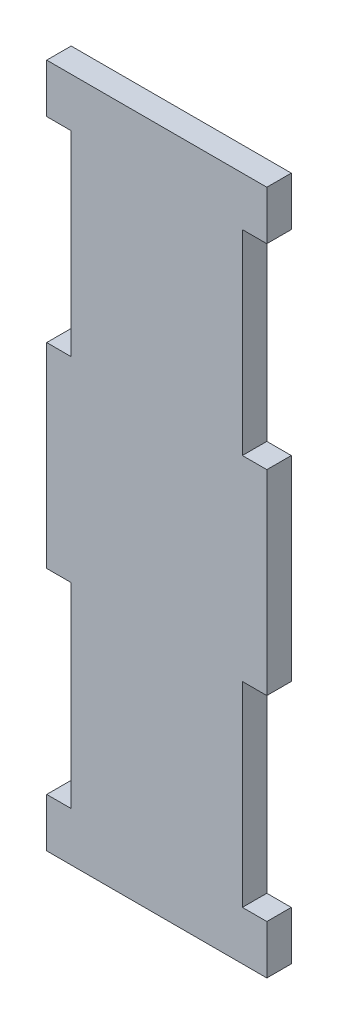
ISO-10303-21;
HEADER;
FILE_DESCRIPTION(('STEP AP214'),'2;1');
FILE_NAME('part.step','',(''),(''),'','','');
FILE_SCHEMA(('AUTOMOTIVE_DESIGN { 1 0 10303 214 1 1 1 1 }'));
ENDSEC;
DATA;
#1=APPLICATION_CONTEXT('core data for automotive mechanical design processes');
#2=APPLICATION_PROTOCOL_DEFINITION('international standard','automotive_design',2000,#1);
#3=PRODUCT_CONTEXT('',#1,'mechanical');
#4=PRODUCT('Part','Part','',(#3));
#5=PRODUCT_RELATED_PRODUCT_CATEGORY('part','',(#4));
#6=PRODUCT_DEFINITION_FORMATION('','',#4);
#7=PRODUCT_DEFINITION_CONTEXT('part definition',#1,'design');
#8=PRODUCT_DEFINITION('design','',#6,#7);
#9=PRODUCT_DEFINITION_SHAPE('','',#8);
#10=(LENGTH_UNIT() NAMED_UNIT(*) SI_UNIT(.MILLI.,.METRE.));
#11=(NAMED_UNIT(*) PLANE_ANGLE_UNIT() SI_UNIT($,.RADIAN.));
#12=(NAMED_UNIT(*) SI_UNIT($,.STERADIAN.) SOLID_ANGLE_UNIT());
#13=UNCERTAINTY_MEASURE_WITH_UNIT(LENGTH_MEASURE(1.E-05),#10,'distance_accuracy_value','');
#14=(GEOMETRIC_REPRESENTATION_CONTEXT(3) GLOBAL_UNCERTAINTY_ASSIGNED_CONTEXT((#13)) GLOBAL_UNIT_ASSIGNED_CONTEXT((#10,
#11,#12)) REPRESENTATION_CONTEXT('',''));
#15=CARTESIAN_POINT('',(0.,0.,0.));
#16=DIRECTION('',(0.,0.,1.));
#17=DIRECTION('',(1.,0.,0.));
#18=AXIS2_PLACEMENT_3D('',#15,#16,#17);
#19=CARTESIAN_POINT('',(0.,0.,10.));
#20=DIRECTION('',(1.,0.,0.));
#21=DIRECTION('',(0.,0.,-1.));
#22=AXIS2_PLACEMENT_3D('',#19,#20,#21);
#23=PLANE('',#22);
#24=DIRECTION('',(0.,-1.,0.));
#25=VECTOR('',#24,1.);
#26=CARTESIAN_POINT('',(0.,0.,0.));
#27=LINE('',#26,#25);
#28=CARTESIAN_POINT('',(0.,20.,0.));
#29=VERTEX_POINT('',#28);
#30=CARTESIAN_POINT('',(0.,0.,0.));
#31=VERTEX_POINT('',#30);
#32=EDGE_CURVE('E201',#29,#31,#27,.T.);
#33=ORIENTED_EDGE('',*,*,#32,.T.);
#34=DIRECTION('',(0.,0.,-1.));
#35=VECTOR('',#34,1.);
#36=CARTESIAN_POINT('',(0.,0.,10.));
#37=LINE('',#36,#35);
#38=CARTESIAN_POINT('',(0.,0.,10.));
#39=VERTEX_POINT('',#38);
#40=EDGE_CURVE('E11',#39,#31,#37,.T.);
#41=ORIENTED_EDGE('',*,*,#40,.F.);
#42=DIRECTION('',(0.,-1.,0.));
#43=VECTOR('',#42,1.);
#44=CARTESIAN_POINT('',(0.,0.,10.));
#45=LINE('',#44,#43);
#46=CARTESIAN_POINT('',(0.,20.,10.));
#47=VERTEX_POINT('',#46);
#48=EDGE_CURVE('E239',#47,#39,#45,.T.);
#49=ORIENTED_EDGE('',*,*,#48,.F.);
#50=DIRECTION('',(0.,0.,-1.));
#51=VECTOR('',#50,1.);
#52=CARTESIAN_POINT('',(0.,20.,10.));
#53=LINE('',#52,#51);
#54=EDGE_CURVE('E197',#47,#29,#53,.T.);
#55=ORIENTED_EDGE('',*,*,#54,.T.);
#56=EDGE_LOOP('',(#33,#41,#49,#55));
#57=FACE_BOUND('',#56,.T.);
#58=ADVANCED_FACE('F33',(#57),#23,.F.);
#59=CARTESIAN_POINT('',(0.,0.,10.));
#60=DIRECTION('',(0.,1.,0.));
#61=DIRECTION('',(-1.,0.,0.));
#62=AXIS2_PLACEMENT_3D('',#59,#60,#61);
#63=PLANE('',#62);
#64=DIRECTION('',(1.,0.,0.));
#65=VECTOR('',#64,1.);
#66=CARTESIAN_POINT('',(0.,0.,0.));
#67=LINE('',#66,#65);
#68=CARTESIAN_POINT('',(90.,0.,0.));
#69=VERTEX_POINT('',#68);
#70=EDGE_CURVE('E204',#31,#69,#67,.T.);
#71=ORIENTED_EDGE('',*,*,#70,.T.);
#72=DIRECTION('',(0.,0.,-1.));
#73=VECTOR('',#72,1.);
#74=CARTESIAN_POINT('',(90.,0.,10.));
#75=LINE('',#74,#73);
#76=CARTESIAN_POINT('',(90.,0.,10.));
#77=VERTEX_POINT('',#76);
#78=EDGE_CURVE('E41',#77,#69,#75,.T.);
#79=ORIENTED_EDGE('',*,*,#78,.F.);
#80=DIRECTION('',(1.,0.,0.));
#81=VECTOR('',#80,1.);
#82=CARTESIAN_POINT('',(0.,0.,10.));
#83=LINE('',#82,#81);
#84=EDGE_CURVE('E128',#39,#77,#83,.T.);
#85=ORIENTED_EDGE('',*,*,#84,.F.);
#86=ORIENTED_EDGE('',*,*,#40,.T.);
#87=EDGE_LOOP('',(#71,#79,#85,#86));
#88=FACE_BOUND('',#87,.T.);
#89=ADVANCED_FACE('F357',(#88),#63,.F.);
#90=CARTESIAN_POINT('',(90.,0.,10.));
#91=DIRECTION('',(-1.,0.,0.));
#92=DIRECTION('',(0.,0.,1.));
#93=AXIS2_PLACEMENT_3D('',#90,#91,#92);
#94=PLANE('',#93);
#95=DIRECTION('',(0.,1.,0.));
#96=VECTOR('',#95,1.);
#97=CARTESIAN_POINT('',(90.,0.,0.));
#98=LINE('',#97,#96);
#99=CARTESIAN_POINT('',(90.,20.,0.));
#100=VERTEX_POINT('',#99);
#101=EDGE_CURVE('E206',#69,#100,#98,.T.);
#102=ORIENTED_EDGE('',*,*,#101,.T.);
#103=DIRECTION('',(0.,0.,-1.));
#104=VECTOR('',#103,1.);
#105=CARTESIAN_POINT('',(90.,20.,10.));
#106=LINE('',#105,#104);
#107=CARTESIAN_POINT('',(90.,20.,10.));
#108=VERTEX_POINT('',#107);
#109=EDGE_CURVE('E282',#108,#100,#106,.T.);
#110=ORIENTED_EDGE('',*,*,#109,.F.);
#111=DIRECTION('',(0.,1.,0.));
#112=VECTOR('',#111,1.);
#113=CARTESIAN_POINT('',(90.,0.,10.));
#114=LINE('',#113,#112);
#115=EDGE_CURVE('E290',#77,#108,#114,.T.);
#116=ORIENTED_EDGE('',*,*,#115,.F.);
#117=ORIENTED_EDGE('',*,*,#78,.T.);
#118=EDGE_LOOP('',(#102,#110,#116,#117));
#119=FACE_BOUND('',#118,.T.);
#120=ADVANCED_FACE('F288',(#119),#94,.F.);
#121=CARTESIAN_POINT('',(90.,20.,10.));
#122=DIRECTION('',(0.,-1.,0.));
#123=DIRECTION('',(1.,0.,0.));
#124=AXIS2_PLACEMENT_3D('',#121,#122,#123);
#125=PLANE('',#124);
#126=DIRECTION('',(-1.,0.,0.));
#127=VECTOR('',#126,1.);
#128=CARTESIAN_POINT('',(90.,20.,0.));
#129=LINE('',#128,#127);
#130=CARTESIAN_POINT('',(80.,20.,0.));
#131=VERTEX_POINT('',#130);
#132=EDGE_CURVE('E208',#100,#131,#129,.T.);
#133=ORIENTED_EDGE('',*,*,#132,.T.);
#134=DIRECTION('',(0.,0.,-1.));
#135=VECTOR('',#134,1.);
#136=CARTESIAN_POINT('',(80.,20.,10.));
#137=LINE('',#136,#135);
#138=CARTESIAN_POINT('',(80.,20.,10.));
#139=VERTEX_POINT('',#138);
#140=EDGE_CURVE('E279',#139,#131,#137,.T.);
#141=ORIENTED_EDGE('',*,*,#140,.F.);
#142=DIRECTION('',(-1.,0.,0.));
#143=VECTOR('',#142,1.);
#144=CARTESIAN_POINT('',(90.,20.,10.));
#145=LINE('',#144,#143);
#146=EDGE_CURVE('E308',#108,#139,#145,.T.);
#147=ORIENTED_EDGE('',*,*,#146,.F.);
#148=ORIENTED_EDGE('',*,*,#109,.T.);
#149=EDGE_LOOP('',(#133,#141,#147,#148));
#150=FACE_BOUND('',#149,.T.);
#151=ADVANCED_FACE('F299',(#150),#125,.F.);
#152=CARTESIAN_POINT('',(80.,20.,10.));
#153=DIRECTION('',(-1.,0.,0.));
#154=DIRECTION('',(0.,-1.,0.));
#155=AXIS2_PLACEMENT_3D('',#152,#153,#154);
#156=PLANE('',#155);
#157=DIRECTION('',(0.,1.,0.));
#158=VECTOR('',#157,1.);
#159=CARTESIAN_POINT('',(80.,20.,0.));
#160=LINE('',#159,#158);
#161=CARTESIAN_POINT('',(79.9999999999999,100.,0.));
#162=VERTEX_POINT('',#161);
#163=EDGE_CURVE('E210',#131,#162,#160,.T.);
#164=ORIENTED_EDGE('',*,*,#163,.T.);
#165=DIRECTION('',(0.,0.,-1.));
#166=VECTOR('',#165,1.);
#167=CARTESIAN_POINT('',(79.9999999999999,100.,10.));
#168=LINE('',#167,#166);
#169=CARTESIAN_POINT('',(79.9999999999999,100.,10.));
#170=VERTEX_POINT('',#169);
#171=EDGE_CURVE('E276',#170,#162,#168,.T.);
#172=ORIENTED_EDGE('',*,*,#171,.F.);
#173=DIRECTION('',(0.,1.,0.));
#174=VECTOR('',#173,1.);
#175=CARTESIAN_POINT('',(80.,20.,10.));
#176=LINE('',#175,#174);
#177=EDGE_CURVE('E305',#139,#170,#176,.T.);
#178=ORIENTED_EDGE('',*,*,#177,.F.);
#179=ORIENTED_EDGE('',*,*,#140,.T.);
#180=EDGE_LOOP('',(#164,#172,#178,#179));
#181=FACE_BOUND('',#180,.T.);
#182=ADVANCED_FACE('F303',(#181),#156,.F.);
#183=CARTESIAN_POINT('',(79.9999999999999,100.,10.));
#184=DIRECTION('',(0.,1.,0.));
#185=DIRECTION('',(0.,0.,1.));
#186=AXIS2_PLACEMENT_3D('',#183,#184,#185);
#187=PLANE('',#186);
#188=DIRECTION('',(1.,0.,0.));
#189=VECTOR('',#188,1.);
#190=CARTESIAN_POINT('',(79.9999999999999,100.,0.));
#191=LINE('',#190,#189);
#192=CARTESIAN_POINT('',(90.,100.,0.));
#193=VERTEX_POINT('',#192);
#194=EDGE_CURVE('E212',#162,#193,#191,.T.);
#195=ORIENTED_EDGE('',*,*,#194,.T.);
#196=DIRECTION('',(0.,0.,-1.));
#197=VECTOR('',#196,1.);
#198=CARTESIAN_POINT('',(90.,100.,10.));
#199=LINE('',#198,#197);
#200=CARTESIAN_POINT('',(90.,100.,10.));
#201=VERTEX_POINT('',#200);
#202=EDGE_CURVE('E273',#201,#193,#199,.T.);
#203=ORIENTED_EDGE('',*,*,#202,.F.);
#204=DIRECTION('',(1.,0.,0.));
#205=VECTOR('',#204,1.);
#206=CARTESIAN_POINT('',(79.9999999999999,100.,10.));
#207=LINE('',#206,#205);
#208=EDGE_CURVE('E307',#170,#201,#207,.T.);
#209=ORIENTED_EDGE('',*,*,#208,.F.);
#210=ORIENTED_EDGE('',*,*,#171,.T.);
#211=EDGE_LOOP('',(#195,#203,#209,#210));
#212=FACE_BOUND('',#211,.T.);
#213=ADVANCED_FACE('F370',(#212),#187,.F.);
#214=CARTESIAN_POINT('',(90.,100.,10.));
#215=DIRECTION('',(-1.,0.,0.));
#216=DIRECTION('',(0.,-1.,0.));
#217=AXIS2_PLACEMENT_3D('',#214,#215,#216);
#218=PLANE('',#217);
#219=DIRECTION('',(0.,1.,0.));
#220=VECTOR('',#219,1.);
#221=CARTESIAN_POINT('',(90.,100.,0.));
#222=LINE('',#221,#220);
#223=CARTESIAN_POINT('',(90.,180.,0.));
#224=VERTEX_POINT('',#223);
#225=EDGE_CURVE('E214',#193,#224,#222,.T.);
#226=ORIENTED_EDGE('',*,*,#225,.T.);
#227=DIRECTION('',(0.,0.,-1.));
#228=VECTOR('',#227,1.);
#229=CARTESIAN_POINT('',(90.,180.,10.));
#230=LINE('',#229,#228);
#231=CARTESIAN_POINT('',(90.,180.,10.));
#232=VERTEX_POINT('',#231);
#233=EDGE_CURVE('E270',#232,#224,#230,.T.);
#234=ORIENTED_EDGE('',*,*,#233,.F.);
#235=DIRECTION('',(0.,1.,0.));
#236=VECTOR('',#235,1.);
#237=CARTESIAN_POINT('',(90.,100.,10.));
#238=LINE('',#237,#236);
#239=EDGE_CURVE('E310',#201,#232,#238,.T.);
#240=ORIENTED_EDGE('',*,*,#239,.F.);
#241=ORIENTED_EDGE('',*,*,#202,.T.);
#242=EDGE_LOOP('',(#226,#234,#240,#241));
#243=FACE_BOUND('',#242,.T.);
#244=ADVANCED_FACE('F373',(#243),#218,.F.);
#245=CARTESIAN_POINT('',(90.,180.,10.));
#246=DIRECTION('',(0.,-1.,0.));
#247=DIRECTION('',(0.,0.,-1.));
#248=AXIS2_PLACEMENT_3D('',#245,#246,#247);
#249=PLANE('',#248);
#250=DIRECTION('',(-1.,0.,0.));
#251=VECTOR('',#250,1.);
#252=CARTESIAN_POINT('',(90.,180.,0.));
#253=LINE('',#252,#251);
#254=CARTESIAN_POINT('',(79.9999999999999,180.,0.));
#255=VERTEX_POINT('',#254);
#256=EDGE_CURVE('E216',#224,#255,#253,.T.);
#257=ORIENTED_EDGE('',*,*,#256,.T.);
#258=DIRECTION('',(0.,0.,-1.));
#259=VECTOR('',#258,1.);
#260=CARTESIAN_POINT('',(79.9999999999999,180.,10.));
#261=LINE('',#260,#259);
#262=CARTESIAN_POINT('',(79.9999999999999,180.,10.));
#263=VERTEX_POINT('',#262);
#264=EDGE_CURVE('E267',#263,#255,#261,.T.);
#265=ORIENTED_EDGE('',*,*,#264,.F.);
#266=DIRECTION('',(-1.,0.,0.));
#267=VECTOR('',#266,1.);
#268=CARTESIAN_POINT('',(90.,180.,10.));
#269=LINE('',#268,#267);
#270=EDGE_CURVE('E316',#232,#263,#269,.T.);
#271=ORIENTED_EDGE('',*,*,#270,.F.);
#272=ORIENTED_EDGE('',*,*,#233,.T.);
#273=EDGE_LOOP('',(#257,#265,#271,#272));
#274=FACE_BOUND('',#273,.T.);
#275=ADVANCED_FACE('F377',(#274),#249,.F.);
#276=CARTESIAN_POINT('',(79.9999999999999,180.,10.));
#277=DIRECTION('',(-1.,0.,0.));
#278=DIRECTION('',(0.,-1.,0.));
#279=AXIS2_PLACEMENT_3D('',#276,#277,#278);
#280=PLANE('',#279);
#281=DIRECTION('',(0.,1.,0.));
#282=VECTOR('',#281,1.);
#283=CARTESIAN_POINT('',(79.9999999999999,180.,0.));
#284=LINE('',#283,#282);
#285=CARTESIAN_POINT('',(79.9999999999999,260.,0.));
#286=VERTEX_POINT('',#285);
#287=EDGE_CURVE('E218',#255,#286,#284,.T.);
#288=ORIENTED_EDGE('',*,*,#287,.T.);
#289=DIRECTION('',(0.,0.,-1.));
#290=VECTOR('',#289,1.);
#291=CARTESIAN_POINT('',(79.9999999999999,260.,10.));
#292=LINE('',#291,#290);
#293=CARTESIAN_POINT('',(79.9999999999999,260.,10.));
#294=VERTEX_POINT('',#293);
#295=EDGE_CURVE('E264',#294,#286,#292,.T.);
#296=ORIENTED_EDGE('',*,*,#295,.F.);
#297=DIRECTION('',(0.,1.,0.));
#298=VECTOR('',#297,1.);
#299=CARTESIAN_POINT('',(79.9999999999999,180.,10.));
#300=LINE('',#299,#298);
#301=EDGE_CURVE('E318',#263,#294,#300,.T.);
#302=ORIENTED_EDGE('',*,*,#301,.F.);
#303=ORIENTED_EDGE('',*,*,#264,.T.);
#304=EDGE_LOOP('',(#288,#296,#302,#303));
#305=FACE_BOUND('',#304,.T.);
#306=ADVANCED_FACE('F381',(#305),#280,.F.);
#307=CARTESIAN_POINT('',(79.9999999999999,260.,10.));
#308=DIRECTION('',(0.,1.,0.));
#309=DIRECTION('',(0.,0.,1.));
#310=AXIS2_PLACEMENT_3D('',#307,#308,#309);
#311=PLANE('',#310);
#312=DIRECTION('',(1.,0.,0.));
#313=VECTOR('',#312,1.);
#314=CARTESIAN_POINT('',(79.9999999999999,260.,0.));
#315=LINE('',#314,#313);
#316=CARTESIAN_POINT('',(89.9999999999999,260.,0.));
#317=VERTEX_POINT('',#316);
#318=EDGE_CURVE('E220',#286,#317,#315,.T.);
#319=ORIENTED_EDGE('',*,*,#318,.T.);
#320=DIRECTION('',(0.,0.,-1.));
#321=VECTOR('',#320,1.);
#322=CARTESIAN_POINT('',(89.9999999999999,260.,10.));
#323=LINE('',#322,#321);
#324=CARTESIAN_POINT('',(89.9999999999999,260.,10.));
#325=VERTEX_POINT('',#324);
#326=EDGE_CURVE('E261',#325,#317,#323,.T.);
#327=ORIENTED_EDGE('',*,*,#326,.F.);
#328=DIRECTION('',(1.,0.,0.));
#329=VECTOR('',#328,1.);
#330=CARTESIAN_POINT('',(79.9999999999999,260.,10.));
#331=LINE('',#330,#329);
#332=EDGE_CURVE('E320',#294,#325,#331,.T.);
#333=ORIENTED_EDGE('',*,*,#332,.F.);
#334=ORIENTED_EDGE('',*,*,#295,.T.);
#335=EDGE_LOOP('',(#319,#327,#333,#334));
#336=FACE_BOUND('',#335,.T.);
#337=ADVANCED_FACE('F385',(#336),#311,.F.);
#338=CARTESIAN_POINT('',(89.9999999999999,260.,10.));
#339=DIRECTION('',(-1.,0.,0.));
#340=DIRECTION('',(0.,0.,1.));
#341=AXIS2_PLACEMENT_3D('',#338,#339,#340);
#342=PLANE('',#341);
#343=DIRECTION('',(0.,1.,0.));
#344=VECTOR('',#343,1.);
#345=CARTESIAN_POINT('',(89.9999999999999,260.,0.));
#346=LINE('',#345,#344);
#347=CARTESIAN_POINT('',(89.9999999999999,280.,0.));
#348=VERTEX_POINT('',#347);
#349=EDGE_CURVE('E222',#317,#348,#346,.T.);
#350=ORIENTED_EDGE('',*,*,#349,.T.);
#351=DIRECTION('',(0.,0.,-1.));
#352=VECTOR('',#351,1.);
#353=CARTESIAN_POINT('',(89.9999999999999,280.,10.));
#354=LINE('',#353,#352);
#355=CARTESIAN_POINT('',(89.9999999999999,280.,10.));
#356=VERTEX_POINT('',#355);
#357=EDGE_CURVE('E258',#356,#348,#354,.T.);
#358=ORIENTED_EDGE('',*,*,#357,.F.);
#359=DIRECTION('',(0.,1.,0.));
#360=VECTOR('',#359,1.);
#361=CARTESIAN_POINT('',(89.9999999999999,260.,10.));
#362=LINE('',#361,#360);
#363=EDGE_CURVE('E322',#325,#356,#362,.T.);
#364=ORIENTED_EDGE('',*,*,#363,.F.);
#365=ORIENTED_EDGE('',*,*,#326,.T.);
#366=EDGE_LOOP('',(#350,#358,#364,#365));
#367=FACE_BOUND('',#366,.T.);
#368=ADVANCED_FACE('F389',(#367),#342,.F.);
#369=CARTESIAN_POINT('',(0.,280.,10.));
#370=DIRECTION('',(0.,-1.,0.));
#371=DIRECTION('',(0.,0.,-1.));
#372=AXIS2_PLACEMENT_3D('',#369,#370,#371);
#373=PLANE('',#372);
#374=DIRECTION('',(-1.,0.,0.));
#375=VECTOR('',#374,1.);
#376=CARTESIAN_POINT('',(0.,280.,0.));
#377=LINE('',#376,#375);
#378=CARTESIAN_POINT('',(0.,280.,0.));
#379=VERTEX_POINT('',#378);
#380=EDGE_CURVE('E224',#348,#379,#377,.T.);
#381=ORIENTED_EDGE('',*,*,#380,.T.);
#382=DIRECTION('',(0.,0.,-1.));
#383=VECTOR('',#382,1.);
#384=CARTESIAN_POINT('',(0.,280.,10.));
#385=LINE('',#384,#383);
#386=CARTESIAN_POINT('',(0.,280.,10.));
#387=VERTEX_POINT('',#386);
#388=EDGE_CURVE('E255',#387,#379,#385,.T.);
#389=ORIENTED_EDGE('',*,*,#388,.F.);
#390=DIRECTION('',(-1.,0.,0.));
#391=VECTOR('',#390,1.);
#392=CARTESIAN_POINT('',(0.,280.,10.));
#393=LINE('',#392,#391);
#394=EDGE_CURVE('E324',#356,#387,#393,.T.);
#395=ORIENTED_EDGE('',*,*,#394,.F.);
#396=ORIENTED_EDGE('',*,*,#357,.T.);
#397=EDGE_LOOP('',(#381,#389,#395,#396));
#398=FACE_BOUND('',#397,.T.);
#399=ADVANCED_FACE('F393',(#398),#373,.F.);
#400=CARTESIAN_POINT('',(0.,260.,10.));
#401=DIRECTION('',(1.,0.,0.));
#402=DIRECTION('',(0.,0.,-1.));
#403=AXIS2_PLACEMENT_3D('',#400,#401,#402);
#404=PLANE('',#403);
#405=DIRECTION('',(0.,-1.,0.));
#406=VECTOR('',#405,1.);
#407=CARTESIAN_POINT('',(0.,260.,0.));
#408=LINE('',#407,#406);
#409=CARTESIAN_POINT('',(0.,260.,0.));
#410=VERTEX_POINT('',#409);
#411=EDGE_CURVE('E226',#379,#410,#408,.T.);
#412=ORIENTED_EDGE('',*,*,#411,.T.);
#413=DIRECTION('',(0.,0.,-1.));
#414=VECTOR('',#413,1.);
#415=CARTESIAN_POINT('',(0.,260.,10.));
#416=LINE('',#415,#414);
#417=CARTESIAN_POINT('',(0.,260.,10.));
#418=VERTEX_POINT('',#417);
#419=EDGE_CURVE('E252',#418,#410,#416,.T.);
#420=ORIENTED_EDGE('',*,*,#419,.F.);
#421=DIRECTION('',(0.,-1.,0.));
#422=VECTOR('',#421,1.);
#423=CARTESIAN_POINT('',(0.,260.,10.));
#424=LINE('',#423,#422);
#425=EDGE_CURVE('E326',#387,#418,#424,.T.);
#426=ORIENTED_EDGE('',*,*,#425,.F.);
#427=ORIENTED_EDGE('',*,*,#388,.T.);
#428=EDGE_LOOP('',(#412,#420,#426,#427));
#429=FACE_BOUND('',#428,.T.);
#430=ADVANCED_FACE('F397',(#429),#404,.F.);
#431=CARTESIAN_POINT('',(10.,260.,10.));
#432=DIRECTION('',(0.,1.,0.));
#433=DIRECTION('',(0.,0.,1.));
#434=AXIS2_PLACEMENT_3D('',#431,#432,#433);
#435=PLANE('',#434);
#436=DIRECTION('',(1.,0.,0.));
#437=VECTOR('',#436,1.);
#438=CARTESIAN_POINT('',(10.,260.,0.));
#439=LINE('',#438,#437);
#440=CARTESIAN_POINT('',(10.,260.,0.));
#441=VERTEX_POINT('',#440);
#442=EDGE_CURVE('E228',#410,#441,#439,.T.);
#443=ORIENTED_EDGE('',*,*,#442,.T.);
#444=DIRECTION('',(0.,0.,-1.));
#445=VECTOR('',#444,1.);
#446=CARTESIAN_POINT('',(10.,260.,10.));
#447=LINE('',#446,#445);
#448=CARTESIAN_POINT('',(10.,260.,10.));
#449=VERTEX_POINT('',#448);
#450=EDGE_CURVE('E249',#449,#441,#447,.T.);
#451=ORIENTED_EDGE('',*,*,#450,.F.);
#452=DIRECTION('',(1.,0.,0.));
#453=VECTOR('',#452,1.);
#454=CARTESIAN_POINT('',(10.,260.,10.));
#455=LINE('',#454,#453);
#456=EDGE_CURVE('E328',#418,#449,#455,.T.);
#457=ORIENTED_EDGE('',*,*,#456,.F.);
#458=ORIENTED_EDGE('',*,*,#419,.T.);
#459=EDGE_LOOP('',(#443,#451,#457,#458));
#460=FACE_BOUND('',#459,.T.);
#461=ADVANCED_FACE('F401',(#460),#435,.F.);
#462=CARTESIAN_POINT('',(10.,180.,10.));
#463=DIRECTION('',(1.,0.,0.));
#464=DIRECTION('',(0.,0.,-1.));
#465=AXIS2_PLACEMENT_3D('',#462,#463,#464);
#466=PLANE('',#465);
#467=DIRECTION('',(0.,-1.,0.));
#468=VECTOR('',#467,1.);
#469=CARTESIAN_POINT('',(10.,180.,0.));
#470=LINE('',#469,#468);
#471=CARTESIAN_POINT('',(10.,180.,0.));
#472=VERTEX_POINT('',#471);
#473=EDGE_CURVE('E230',#441,#472,#470,.T.);
#474=ORIENTED_EDGE('',*,*,#473,.T.);
#475=DIRECTION('',(0.,0.,-1.));
#476=VECTOR('',#475,1.);
#477=CARTESIAN_POINT('',(10.,180.,10.));
#478=LINE('',#477,#476);
#479=CARTESIAN_POINT('',(10.,180.,10.));
#480=VERTEX_POINT('',#479);
#481=EDGE_CURVE('E246',#480,#472,#478,.T.);
#482=ORIENTED_EDGE('',*,*,#481,.F.);
#483=DIRECTION('',(0.,-1.,0.));
#484=VECTOR('',#483,1.);
#485=CARTESIAN_POINT('',(10.,180.,10.));
#486=LINE('',#485,#484);
#487=EDGE_CURVE('E330',#449,#480,#486,.T.);
#488=ORIENTED_EDGE('',*,*,#487,.F.);
#489=ORIENTED_EDGE('',*,*,#450,.T.);
#490=EDGE_LOOP('',(#474,#482,#488,#489));
#491=FACE_BOUND('',#490,.T.);
#492=ADVANCED_FACE('F405',(#491),#466,.F.);
#493=CARTESIAN_POINT('',(0.,180.,10.));
#494=DIRECTION('',(0.,-1.,0.));
#495=DIRECTION('',(0.,0.,-1.));
#496=AXIS2_PLACEMENT_3D('',#493,#494,#495);
#497=PLANE('',#496);
#498=DIRECTION('',(-1.,0.,0.));
#499=VECTOR('',#498,1.);
#500=CARTESIAN_POINT('',(0.,180.,0.));
#501=LINE('',#500,#499);
#502=CARTESIAN_POINT('',(0.,180.,0.));
#503=VERTEX_POINT('',#502);
#504=EDGE_CURVE('E232',#472,#503,#501,.T.);
#505=ORIENTED_EDGE('',*,*,#504,.T.);
#506=DIRECTION('',(0.,0.,-1.));
#507=VECTOR('',#506,1.);
#508=CARTESIAN_POINT('',(0.,180.,10.));
#509=LINE('',#508,#507);
#510=CARTESIAN_POINT('',(0.,180.,10.));
#511=VERTEX_POINT('',#510);
#512=EDGE_CURVE('E243',#511,#503,#509,.T.);
#513=ORIENTED_EDGE('',*,*,#512,.F.);
#514=DIRECTION('',(-1.,0.,0.));
#515=VECTOR('',#514,1.);
#516=CARTESIAN_POINT('',(0.,180.,10.));
#517=LINE('',#516,#515);
#518=EDGE_CURVE('E332',#480,#511,#517,.T.);
#519=ORIENTED_EDGE('',*,*,#518,.F.);
#520=ORIENTED_EDGE('',*,*,#481,.T.);
#521=EDGE_LOOP('',(#505,#513,#519,#520));
#522=FACE_BOUND('',#521,.T.);
#523=ADVANCED_FACE('F338',(#522),#497,.F.);
#524=CARTESIAN_POINT('',(0.,100.,10.));
#525=DIRECTION('',(1.,0.,0.));
#526=DIRECTION('',(0.,0.,-1.));
#527=AXIS2_PLACEMENT_3D('',#524,#525,#526);
#528=PLANE('',#527);
#529=DIRECTION('',(0.,-1.,0.));
#530=VECTOR('',#529,1.);
#531=CARTESIAN_POINT('',(0.,100.,0.));
#532=LINE('',#531,#530);
#533=CARTESIAN_POINT('',(0.,100.,0.));
#534=VERTEX_POINT('',#533);
#535=EDGE_CURVE('E234',#503,#534,#532,.T.);
#536=ORIENTED_EDGE('',*,*,#535,.T.);
#537=DIRECTION('',(0.,0.,-1.));
#538=VECTOR('',#537,1.);
#539=CARTESIAN_POINT('',(0.,100.,10.));
#540=LINE('',#539,#538);
#541=CARTESIAN_POINT('',(0.,100.,10.));
#542=VERTEX_POINT('',#541);
#543=EDGE_CURVE('E192',#542,#534,#540,.T.);
#544=ORIENTED_EDGE('',*,*,#543,.F.);
#545=DIRECTION('',(0.,-1.,0.));
#546=VECTOR('',#545,1.);
#547=CARTESIAN_POINT('',(0.,100.,10.));
#548=LINE('',#547,#546);
#549=EDGE_CURVE('E183',#511,#542,#548,.T.);
#550=ORIENTED_EDGE('',*,*,#549,.F.);
#551=ORIENTED_EDGE('',*,*,#512,.T.);
#552=EDGE_LOOP('',(#536,#544,#550,#551));
#553=FACE_BOUND('',#552,.T.);
#554=ADVANCED_FACE('F342',(#553),#528,.F.);
#555=CARTESIAN_POINT('',(10.,100.,10.));
#556=DIRECTION('',(0.,1.,0.));
#557=DIRECTION('',(0.,0.,1.));
#558=AXIS2_PLACEMENT_3D('',#555,#556,#557);
#559=PLANE('',#558);
#560=DIRECTION('',(1.,0.,0.));
#561=VECTOR('',#560,1.);
#562=CARTESIAN_POINT('',(10.,100.,0.));
#563=LINE('',#562,#561);
#564=CARTESIAN_POINT('',(10.,100.,0.));
#565=VERTEX_POINT('',#564);
#566=EDGE_CURVE('E191',#534,#565,#563,.T.);
#567=ORIENTED_EDGE('',*,*,#566,.T.);
#568=DIRECTION('',(0.,0.,-1.));
#569=VECTOR('',#568,1.);
#570=CARTESIAN_POINT('',(10.,100.,10.));
#571=LINE('',#570,#569);
#572=CARTESIAN_POINT('',(10.,100.,10.));
#573=VERTEX_POINT('',#572);
#574=EDGE_CURVE('E188',#573,#565,#571,.T.);
#575=ORIENTED_EDGE('',*,*,#574,.F.);
#576=DIRECTION('',(1.,0.,0.));
#577=VECTOR('',#576,1.);
#578=CARTESIAN_POINT('',(10.,100.,10.));
#579=LINE('',#578,#577);
#580=EDGE_CURVE('E177',#542,#573,#579,.T.);
#581=ORIENTED_EDGE('',*,*,#580,.F.);
#582=ORIENTED_EDGE('',*,*,#543,.T.);
#583=EDGE_LOOP('',(#567,#575,#581,#582));
#584=FACE_BOUND('',#583,.T.);
#585=ADVANCED_FACE('F189',(#584),#559,.F.);
#586=CARTESIAN_POINT('',(10.,20.,10.));
#587=DIRECTION('',(1.,0.,0.));
#588=DIRECTION('',(0.,1.,0.));
#589=AXIS2_PLACEMENT_3D('',#586,#587,#588);
#590=PLANE('',#589);
#591=DIRECTION('',(0.,-1.,0.));
#592=VECTOR('',#591,1.);
#593=CARTESIAN_POINT('',(10.,20.,0.));
#594=LINE('',#593,#592);
#595=CARTESIAN_POINT('',(10.,20.,0.));
#596=VERTEX_POINT('',#595);
#597=EDGE_CURVE('E114',#565,#596,#594,.T.);
#598=ORIENTED_EDGE('',*,*,#597,.T.);
#599=DIRECTION('',(0.,0.,-1.));
#600=VECTOR('',#599,1.);
#601=CARTESIAN_POINT('',(10.,20.,10.));
#602=LINE('',#601,#600);
#603=CARTESIAN_POINT('',(10.,20.,10.));
#604=VERTEX_POINT('',#603);
#605=EDGE_CURVE('E193',#604,#596,#602,.T.);
#606=ORIENTED_EDGE('',*,*,#605,.F.);
#607=DIRECTION('',(0.,-1.,0.));
#608=VECTOR('',#607,1.);
#609=CARTESIAN_POINT('',(10.,20.,10.));
#610=LINE('',#609,#608);
#611=EDGE_CURVE('E181',#573,#604,#610,.T.);
#612=ORIENTED_EDGE('',*,*,#611,.F.);
#613=ORIENTED_EDGE('',*,*,#574,.T.);
#614=EDGE_LOOP('',(#598,#606,#612,#613));
#615=FACE_BOUND('',#614,.T.);
#616=ADVANCED_FACE('F195',(#615),#590,.F.);
#617=CARTESIAN_POINT('',(0.,20.,10.));
#618=DIRECTION('',(0.,-1.,0.));
#619=DIRECTION('',(0.,0.,-1.));
#620=AXIS2_PLACEMENT_3D('',#617,#618,#619);
#621=PLANE('',#620);
#622=DIRECTION('',(-1.,0.,0.));
#623=VECTOR('',#622,1.);
#624=CARTESIAN_POINT('',(0.,20.,0.));
#625=LINE('',#624,#623);
#626=EDGE_CURVE('E120',#596,#29,#625,.T.);
#627=ORIENTED_EDGE('',*,*,#626,.T.);
#628=ORIENTED_EDGE('',*,*,#54,.F.);
#629=DIRECTION('',(-1.,0.,0.));
#630=VECTOR('',#629,1.);
#631=CARTESIAN_POINT('',(0.,20.,10.));
#632=LINE('',#631,#630);
#633=EDGE_CURVE('E49',#604,#47,#632,.T.);
#634=ORIENTED_EDGE('',*,*,#633,.F.);
#635=ORIENTED_EDGE('',*,*,#605,.T.);
#636=EDGE_LOOP('',(#627,#628,#634,#635));
#637=FACE_BOUND('',#636,.T.);
#638=ADVANCED_FACE('F346',(#637),#621,.F.);
#639=CARTESIAN_POINT('',(0.,0.,10.));
#640=DIRECTION('',(0.,0.,-1.));
#641=DIRECTION('',(-1.,0.,0.));
#642=AXIS2_PLACEMENT_3D('',#639,#640,#641);
#643=PLANE('',#642);
#644=ORIENTED_EDGE('',*,*,#48,.T.);
#645=ORIENTED_EDGE('',*,*,#84,.T.);
#646=ORIENTED_EDGE('',*,*,#115,.T.);
#647=ORIENTED_EDGE('',*,*,#146,.T.);
#648=ORIENTED_EDGE('',*,*,#177,.T.);
#649=ORIENTED_EDGE('',*,*,#208,.T.);
#650=ORIENTED_EDGE('',*,*,#239,.T.);
#651=ORIENTED_EDGE('',*,*,#270,.T.);
#652=ORIENTED_EDGE('',*,*,#301,.T.);
#653=ORIENTED_EDGE('',*,*,#332,.T.);
#654=ORIENTED_EDGE('',*,*,#363,.T.);
#655=ORIENTED_EDGE('',*,*,#394,.T.);
#656=ORIENTED_EDGE('',*,*,#425,.T.);
#657=ORIENTED_EDGE('',*,*,#456,.T.);
#658=ORIENTED_EDGE('',*,*,#487,.T.);
#659=ORIENTED_EDGE('',*,*,#518,.T.);
#660=ORIENTED_EDGE('',*,*,#549,.T.);
#661=ORIENTED_EDGE('',*,*,#580,.T.);
#662=ORIENTED_EDGE('',*,*,#611,.T.);
#663=ORIENTED_EDGE('',*,*,#633,.T.);
#664=EDGE_LOOP('',(#644,#645,#646,#647,#648,#649,#650,#651,#652,#653,#654,#655,#656,#657,#658,
#659,#660,#661,#662,#663));
#665=FACE_BOUND('',#664,.T.);
#666=ADVANCED_FACE('F179',(#665),#643,.F.);
#667=CARTESIAN_POINT('',(0.,0.,0.));
#668=DIRECTION('',(0.,0.,-1.));
#669=DIRECTION('',(-1.,0.,0.));
#670=AXIS2_PLACEMENT_3D('',#667,#668,#669);
#671=PLANE('',#670);
#672=ORIENTED_EDGE('',*,*,#32,.F.);
#673=ORIENTED_EDGE('',*,*,#626,.F.);
#674=ORIENTED_EDGE('',*,*,#597,.F.);
#675=ORIENTED_EDGE('',*,*,#566,.F.);
#676=ORIENTED_EDGE('',*,*,#535,.F.);
#677=ORIENTED_EDGE('',*,*,#504,.F.);
#678=ORIENTED_EDGE('',*,*,#473,.F.);
#679=ORIENTED_EDGE('',*,*,#442,.F.);
#680=ORIENTED_EDGE('',*,*,#411,.F.);
#681=ORIENTED_EDGE('',*,*,#380,.F.);
#682=ORIENTED_EDGE('',*,*,#349,.F.);
#683=ORIENTED_EDGE('',*,*,#318,.F.);
#684=ORIENTED_EDGE('',*,*,#287,.F.);
#685=ORIENTED_EDGE('',*,*,#256,.F.);
#686=ORIENTED_EDGE('',*,*,#225,.F.);
#687=ORIENTED_EDGE('',*,*,#194,.F.);
#688=ORIENTED_EDGE('',*,*,#163,.F.);
#689=ORIENTED_EDGE('',*,*,#132,.F.);
#690=ORIENTED_EDGE('',*,*,#101,.F.);
#691=ORIENTED_EDGE('',*,*,#70,.F.);
#692=EDGE_LOOP('',(#672,#673,#674,#675,#676,#677,#678,#679,#680,#681,#682,#683,#684,#685,#686,
#687,#688,#689,#690,#691));
#693=FACE_BOUND('',#692,.T.);
#694=ADVANCED_FACE('F294',(#693),#671,.T.);
#695=CLOSED_SHELL('',(#58,#89,#120,#151,#182,#213,#244,#275,#306,#337,#368,#399,#430,#461,#492,
#523,#554,#585,#616,#638,#666,#694));
#696=MANIFOLD_SOLID_BREP('B2',#695);
#697=ADVANCED_BREP_SHAPE_REPRESENTATION('',(#18,#696),#14);
#698=SHAPE_DEFINITION_REPRESENTATION(#9,#697);
ENDSEC;
END-ISO-10303-21;
